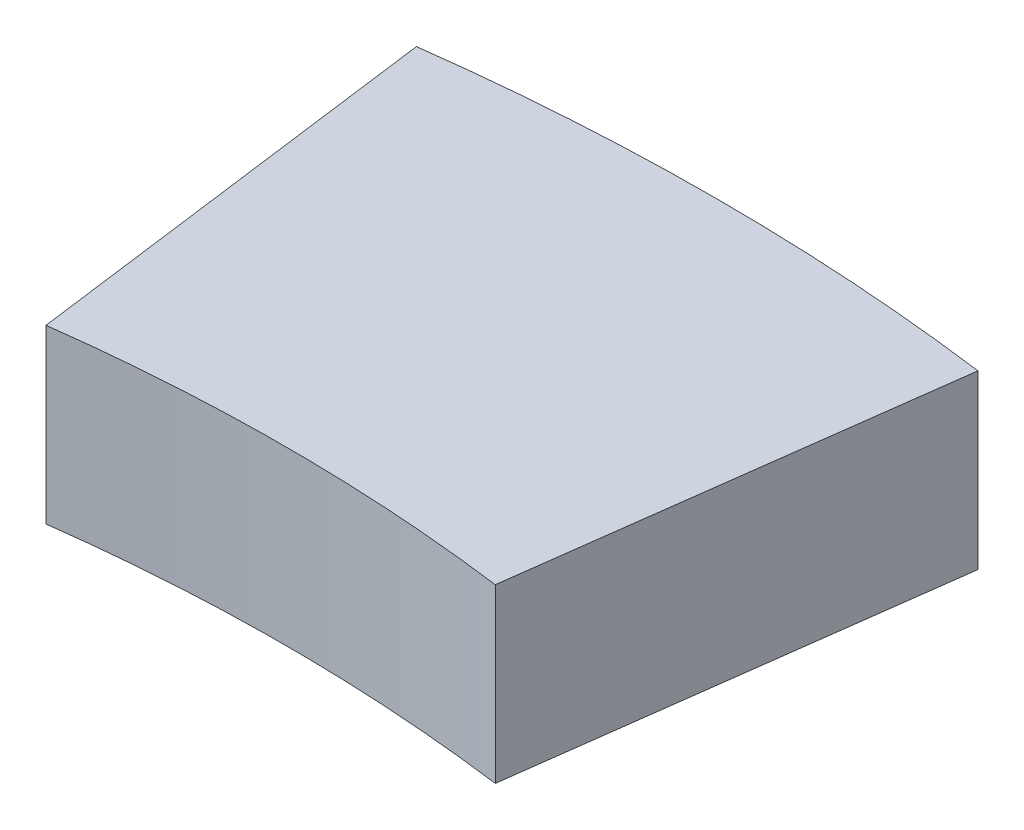
ISO-10303-21;
HEADER;
FILE_DESCRIPTION(('STEP AP214'),'2;1');
FILE_NAME('part.step','',(''),(''),'','','');
FILE_SCHEMA(('AUTOMOTIVE_DESIGN { 1 0 10303 214 1 1 1 1 }'));
ENDSEC;
DATA;
#1=APPLICATION_CONTEXT('core data for automotive mechanical design processes');
#2=APPLICATION_PROTOCOL_DEFINITION('international standard','automotive_design',2000,#1);
#3=PRODUCT_CONTEXT('',#1,'mechanical');
#4=PRODUCT('Part','Part','',(#3));
#5=PRODUCT_RELATED_PRODUCT_CATEGORY('part','',(#4));
#6=PRODUCT_DEFINITION_FORMATION('','',#4);
#7=PRODUCT_DEFINITION_CONTEXT('part definition',#1,'design');
#8=PRODUCT_DEFINITION('design','',#6,#7);
#9=PRODUCT_DEFINITION_SHAPE('','',#8);
#10=(LENGTH_UNIT() NAMED_UNIT(*) SI_UNIT(.MILLI.,.METRE.));
#11=(NAMED_UNIT(*) PLANE_ANGLE_UNIT() SI_UNIT($,.RADIAN.));
#12=(NAMED_UNIT(*) SI_UNIT($,.STERADIAN.) SOLID_ANGLE_UNIT());
#13=UNCERTAINTY_MEASURE_WITH_UNIT(LENGTH_MEASURE(1.E-05),#10,'distance_accuracy_value','');
#14=(GEOMETRIC_REPRESENTATION_CONTEXT(3) GLOBAL_UNCERTAINTY_ASSIGNED_CONTEXT((#13)) GLOBAL_UNIT_ASSIGNED_CONTEXT((#10,
#11,#12)) REPRESENTATION_CONTEXT('',''));
#15=CARTESIAN_POINT('',(0.,0.,0.));
#16=DIRECTION('',(0.,0.,1.));
#17=DIRECTION('',(1.,0.,0.));
#18=AXIS2_PLACEMENT_3D('',#15,#16,#17);
#19=CARTESIAN_POINT('',(0.,10.,0.));
#20=DIRECTION('',(0.,-1.,0.));
#21=DIRECTION('',(0.,0.,-1.));
#22=AXIS2_PLACEMENT_3D('',#19,#20,#21);
#23=CYLINDRICAL_SURFACE('',#22,250.);
#24=CARTESIAN_POINT('',(0.,-10.,0.));
#25=DIRECTION('',(0.,1.,0.));
#26=DIRECTION('',(0.,0.,1.));
#27=AXIS2_PLACEMENT_3D('',#24,#25,#26);
#28=CIRCLE('',#27,250.);
#29=CARTESIAN_POINT('',(32.631548055013,-10.,-247.861215343453));
#30=VERTEX_POINT('',#29);
#31=CARTESIAN_POINT('',(-32.631548055013,-10.,-247.861215343453));
#32=VERTEX_POINT('',#31);
#33=EDGE_CURVE('E96',#30,#32,#28,.T.);
#34=ORIENTED_EDGE('',*,*,#33,.T.);
#35=DIRECTION('',(0.,-1.,0.));
#36=VECTOR('',#35,1.);
#37=CARTESIAN_POINT('',(-32.631548055013,10.,-247.861215343453));
#38=LINE('',#37,#36);
#39=CARTESIAN_POINT('',(-32.631548055013,10.,-247.861215343453));
#40=VERTEX_POINT('',#39);
#41=EDGE_CURVE('E11',#40,#32,#38,.T.);
#42=ORIENTED_EDGE('',*,*,#41,.F.);
#43=CARTESIAN_POINT('',(0.,10.,0.));
#44=DIRECTION('',(0.,1.,0.));
#45=DIRECTION('',(0.,0.,1.));
#46=AXIS2_PLACEMENT_3D('',#43,#44,#45);
#47=CIRCLE('',#46,250.);
#48=CARTESIAN_POINT('',(32.631548055013,10.,-247.861215343453));
#49=VERTEX_POINT('',#48);
#50=EDGE_CURVE('E84',#49,#40,#47,.T.);
#51=ORIENTED_EDGE('',*,*,#50,.F.);
#52=DIRECTION('',(0.,-1.,0.));
#53=VECTOR('',#52,1.);
#54=CARTESIAN_POINT('',(32.631548055013,10.,-247.861215343453));
#55=LINE('',#54,#53);
#56=EDGE_CURVE('E92',#49,#30,#55,.T.);
#57=ORIENTED_EDGE('',*,*,#56,.T.);
#58=EDGE_LOOP('',(#34,#42,#51,#57));
#59=FACE_BOUND('',#58,.T.);
#60=ADVANCED_FACE('F33',(#59),#23,.T.);
#61=CARTESIAN_POINT('',(-32.631548055013,10.,-247.861215343453));
#62=DIRECTION('',(0.99144486137381,0.,-0.130526192220052));
#63=DIRECTION('',(-0.130526192220052,0.,-0.99144486137381));
#64=AXIS2_PLACEMENT_3D('',#61,#62,#63);
#65=PLANE('',#64);
#66=DIRECTION('',(0.130526192220052,0.,0.99144486137381));
#67=VECTOR('',#66,1.);
#68=CARTESIAN_POINT('',(-32.631548055013,-10.,-247.861215343453));
#69=LINE('',#68,#67);
#70=CARTESIAN_POINT('',(-26.1052384440104,-10.,-198.288972274762));
#71=VERTEX_POINT('',#70);
#72=EDGE_CURVE('E88',#32,#71,#69,.T.);
#73=ORIENTED_EDGE('',*,*,#72,.T.);
#74=DIRECTION('',(0.,-1.,0.));
#75=VECTOR('',#74,1.);
#76=CARTESIAN_POINT('',(-26.1052384440104,10.,-198.288972274762));
#77=LINE('',#76,#75);
#78=CARTESIAN_POINT('',(-26.1052384440104,10.,-198.288972274762));
#79=VERTEX_POINT('',#78);
#80=EDGE_CURVE('E41',#79,#71,#77,.T.);
#81=ORIENTED_EDGE('',*,*,#80,.F.);
#82=DIRECTION('',(0.130526192220052,0.,0.99144486137381));
#83=VECTOR('',#82,1.);
#84=CARTESIAN_POINT('',(-32.631548055013,10.,-247.861215343453));
#85=LINE('',#84,#83);
#86=EDGE_CURVE('E79',#40,#79,#85,.T.);
#87=ORIENTED_EDGE('',*,*,#86,.F.);
#88=ORIENTED_EDGE('',*,*,#41,.T.);
#89=EDGE_LOOP('',(#73,#81,#87,#88));
#90=FACE_BOUND('',#89,.T.);
#91=ADVANCED_FACE('F87',(#90),#65,.F.);
#92=CARTESIAN_POINT('',(0.,10.,0.));
#93=DIRECTION('',(0.,-1.,0.));
#94=DIRECTION('',(0.,0.,-1.));
#95=AXIS2_PLACEMENT_3D('',#92,#93,#94);
#96=CYLINDRICAL_SURFACE('',#95,200.);
#97=CARTESIAN_POINT('',(0.,-10.,0.));
#98=DIRECTION('',(0.,-1.,0.));
#99=DIRECTION('',(0.,0.,1.));
#100=AXIS2_PLACEMENT_3D('',#97,#98,#99);
#101=CIRCLE('',#100,200.);
#102=CARTESIAN_POINT('',(26.1052384440104,-10.,-198.288972274762));
#103=VERTEX_POINT('',#102);
#104=EDGE_CURVE('E66',#71,#103,#101,.T.);
#105=ORIENTED_EDGE('',*,*,#104,.T.);
#106=DIRECTION('',(0.,-1.,0.));
#107=VECTOR('',#106,1.);
#108=CARTESIAN_POINT('',(26.1052384440104,10.,-198.288972274762));
#109=LINE('',#108,#107);
#110=CARTESIAN_POINT('',(26.1052384440104,10.,-198.288972274762));
#111=VERTEX_POINT('',#110);
#112=EDGE_CURVE('E89',#111,#103,#109,.T.);
#113=ORIENTED_EDGE('',*,*,#112,.F.);
#114=CARTESIAN_POINT('',(0.,10.,0.));
#115=DIRECTION('',(0.,-1.,0.));
#116=DIRECTION('',(0.,0.,1.));
#117=AXIS2_PLACEMENT_3D('',#114,#115,#116);
#118=CIRCLE('',#117,200.);
#119=EDGE_CURVE('E82',#79,#111,#118,.T.);
#120=ORIENTED_EDGE('',*,*,#119,.F.);
#121=ORIENTED_EDGE('',*,*,#80,.T.);
#122=EDGE_LOOP('',(#105,#113,#120,#121));
#123=FACE_BOUND('',#122,.T.);
#124=ADVANCED_FACE('F90',(#123),#96,.F.);
#125=CARTESIAN_POINT('',(32.631548055013,10.,-247.861215343453));
#126=DIRECTION('',(-0.99144486137381,0.,-0.130526192220052));
#127=DIRECTION('',(-0.130526192220052,0.,0.99144486137381));
#128=AXIS2_PLACEMENT_3D('',#125,#126,#127);
#129=PLANE('',#128);
#130=DIRECTION('',(0.130526192220052,0.,-0.99144486137381));
#131=VECTOR('',#130,1.);
#132=CARTESIAN_POINT('',(32.631548055013,-10.,-247.861215343453));
#133=LINE('',#132,#131);
#134=EDGE_CURVE('E72',#103,#30,#133,.T.);
#135=ORIENTED_EDGE('',*,*,#134,.T.);
#136=ORIENTED_EDGE('',*,*,#56,.F.);
#137=DIRECTION('',(0.130526192220052,0.,-0.99144486137381));
#138=VECTOR('',#137,1.);
#139=CARTESIAN_POINT('',(32.631548055013,10.,-247.861215343453));
#140=LINE('',#139,#138);
#141=EDGE_CURVE('E49',#111,#49,#140,.T.);
#142=ORIENTED_EDGE('',*,*,#141,.F.);
#143=ORIENTED_EDGE('',*,*,#112,.T.);
#144=EDGE_LOOP('',(#135,#136,#142,#143));
#145=FACE_BOUND('',#144,.T.);
#146=ADVANCED_FACE('F103',(#145),#129,.F.);
#147=CARTESIAN_POINT('',(0.,10.,0.));
#148=DIRECTION('',(0.,1.,0.));
#149=DIRECTION('',(0.,0.,1.));
#150=AXIS2_PLACEMENT_3D('',#147,#148,#149);
#151=PLANE('',#150);
#152=ORIENTED_EDGE('',*,*,#50,.T.);
#153=ORIENTED_EDGE('',*,*,#86,.T.);
#154=ORIENTED_EDGE('',*,*,#119,.T.);
#155=ORIENTED_EDGE('',*,*,#141,.T.);
#156=EDGE_LOOP('',(#152,#153,#154,#155));
#157=FACE_BOUND('',#156,.T.);
#158=ADVANCED_FACE('F80',(#157),#151,.T.);
#159=CARTESIAN_POINT('',(0.,-10.,0.));
#160=DIRECTION('',(0.,1.,0.));
#161=DIRECTION('',(0.,0.,1.));
#162=AXIS2_PLACEMENT_3D('',#159,#160,#161);
#163=PLANE('',#162);
#164=ORIENTED_EDGE('',*,*,#33,.F.);
#165=ORIENTED_EDGE('',*,*,#134,.F.);
#166=ORIENTED_EDGE('',*,*,#104,.F.);
#167=ORIENTED_EDGE('',*,*,#72,.F.);
#168=EDGE_LOOP('',(#164,#165,#166,#167));
#169=FACE_BOUND('',#168,.T.);
#170=ADVANCED_FACE('F106',(#169),#163,.F.);
#171=CLOSED_SHELL('',(#60,#91,#124,#146,#158,#170));
#172=MANIFOLD_SOLID_BREP('B2',#171);
#173=ADVANCED_BREP_SHAPE_REPRESENTATION('',(#18,#172),#14);
#174=SHAPE_DEFINITION_REPRESENTATION(#9,#173);
ENDSEC;
END-ISO-10303-21;
